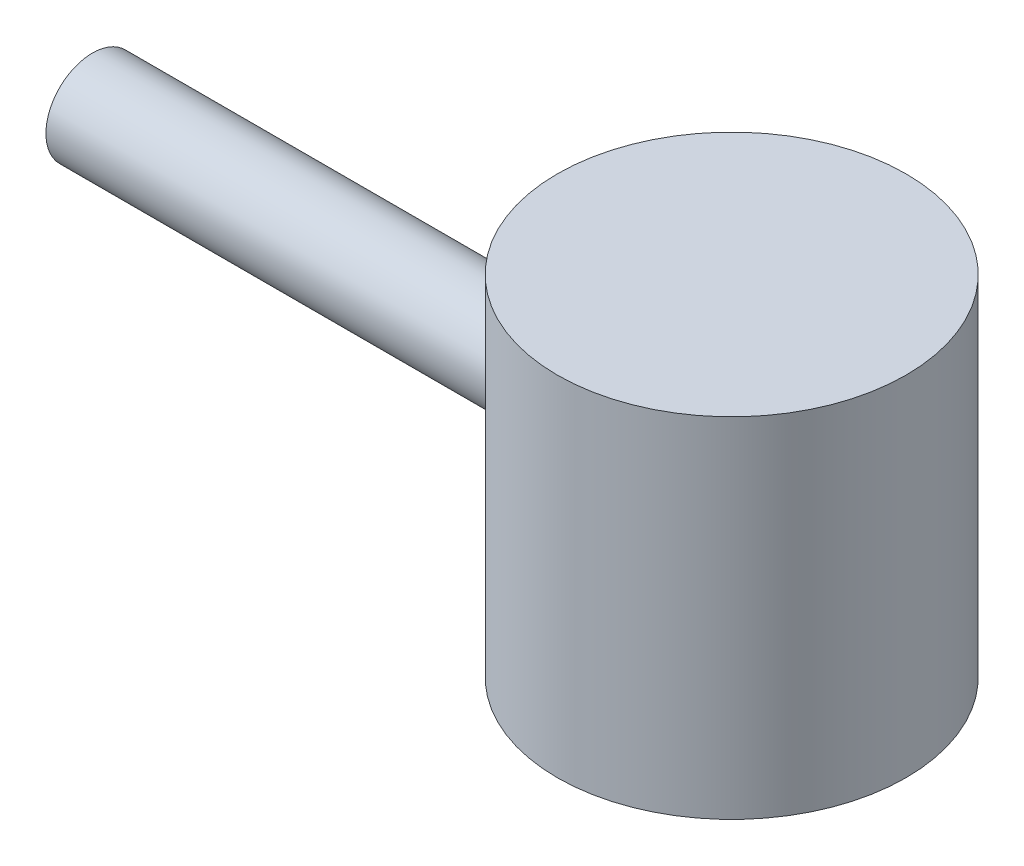
ISO-10303-21;
HEADER;
FILE_DESCRIPTION(('STEP AP214'),'2;1');
FILE_NAME('part.step','',(''),(''),'','','');
FILE_SCHEMA(('AUTOMOTIVE_DESIGN { 1 0 10303 214 1 1 1 1 }'));
ENDSEC;
DATA;
#1=APPLICATION_CONTEXT('core data for automotive mechanical design processes');
#2=APPLICATION_PROTOCOL_DEFINITION('international standard','automotive_design',2000,#1);
#3=PRODUCT_CONTEXT('',#1,'mechanical');
#4=PRODUCT('Part','Part','',(#3));
#5=PRODUCT_RELATED_PRODUCT_CATEGORY('part','',(#4));
#6=PRODUCT_DEFINITION_FORMATION('','',#4);
#7=PRODUCT_DEFINITION_CONTEXT('part definition',#1,'design');
#8=PRODUCT_DEFINITION('design','',#6,#7);
#9=PRODUCT_DEFINITION_SHAPE('','',#8);
#10=(LENGTH_UNIT() NAMED_UNIT(*) SI_UNIT(.MILLI.,.METRE.));
#11=(NAMED_UNIT(*) PLANE_ANGLE_UNIT() SI_UNIT($,.RADIAN.));
#12=(NAMED_UNIT(*) SI_UNIT($,.STERADIAN.) SOLID_ANGLE_UNIT());
#13=UNCERTAINTY_MEASURE_WITH_UNIT(LENGTH_MEASURE(1.E-05),#10,'distance_accuracy_value','');
#14=(GEOMETRIC_REPRESENTATION_CONTEXT(3) GLOBAL_UNCERTAINTY_ASSIGNED_CONTEXT((#13)) GLOBAL_UNIT_ASSIGNED_CONTEXT((#10,
#11,#12)) REPRESENTATION_CONTEXT('',''));
#15=CARTESIAN_POINT('',(0.,0.,0.));
#16=DIRECTION('',(0.,0.,1.));
#17=DIRECTION('',(1.,0.,0.));
#18=AXIS2_PLACEMENT_3D('',#15,#16,#17);
#19=CARTESIAN_POINT('',(0.,7.5,0.));
#20=DIRECTION('',(0.,-1.,0.));
#21=DIRECTION('',(0.,0.,-1.));
#22=AXIS2_PLACEMENT_3D('',#19,#20,#21);
#23=CYLINDRICAL_SURFACE('',#22,7.5);
#24=CARTESIAN_POINT('',(-7.22841614740048,0.,-2.));
#25=CARTESIAN_POINT('',(-7.22841805697252,0.110175937740283,-1.99999734315871));
#26=CARTESIAN_POINT('',(-7.23096264549673,0.220380000476016,-1.99086493224743));
#27=CARTESIAN_POINT('',(-7.24083561155097,0.437605421556373,-1.95464583260237));
#28=CARTESIAN_POINT('',(-7.24816638907934,0.54462515497806,-1.92755013620953));
#29=CARTESIAN_POINT('',(-7.26672375176839,0.752308069946777,-1.85635845560073));
#30=CARTESIAN_POINT('',(-7.27794485684204,0.852979958828426,-1.81228637542178));
#31=CARTESIAN_POINT('',(-7.30301154920401,1.04551674005983,-1.70846784563703));
#32=CARTESIAN_POINT('',(-7.31685734034424,1.13738094750699,-1.6487201784145));
#33=CARTESIAN_POINT('',(-7.34600139553467,1.31199254698772,-1.51364847874559));
#34=CARTESIAN_POINT('',(-7.36132541116443,1.39448701746446,-1.43800297504208));
#35=CARTESIAN_POINT('',(-7.39147701436507,1.5457815769512,-1.27397427284021));
#36=CARTESIAN_POINT('',(-7.40630455033439,1.61458024614179,-1.18558975534664));
#37=CARTESIAN_POINT('',(-7.43407988468418,1.73758493840293,-0.99683817087327));
#38=CARTESIAN_POINT('',(-7.44699376262293,1.79153951863286,-0.89630181987948));
#39=CARTESIAN_POINT('',(-7.46919126211834,1.88168463536726,-0.687183044729091));
#40=CARTESIAN_POINT('',(-7.47847549576262,1.91787816728156,-0.578601980875103));
#41=CARTESIAN_POINT('',(-7.49218553576461,1.97065522023577,-0.35911596181009));
#42=CARTESIAN_POINT('',(-7.49671776750265,1.98766897662592,-0.248321224200916));
#43=CARTESIAN_POINT('',(-7.50078524617749,2.00295712010718,-0.0253635535085758));
#44=CARTESIAN_POINT('',(-7.50032132946608,2.00123464363014,0.0867991474385297));
#45=CARTESIAN_POINT('',(-7.49452675859765,1.97940218746053,0.306314237111346));
#46=CARTESIAN_POINT('',(-7.48931914026999,1.95975704236371,0.41371660072111));
#47=CARTESIAN_POINT('',(-7.4747674859047,1.90338786221805,0.623641315571054));
#48=CARTESIAN_POINT('',(-7.46542321400589,1.86666285331396,0.72616338818058));
#49=CARTESIAN_POINT('',(-7.44346569099892,1.77682015240762,0.924603945147553));
#50=CARTESIAN_POINT('',(-7.43082087877672,1.7235431928993,1.02044668632954));
#51=CARTESIAN_POINT('',(-7.40362468509504,1.6022311804909,1.20198999876451));
#52=CARTESIAN_POINT('',(-7.38907293223,1.53419325097182,1.28768858808586));
#53=CARTESIAN_POINT('',(-7.35911272938719,1.38282314206609,1.44928536946561));
#54=CARTESIAN_POINT('',(-7.34369169368738,1.29908555495064,1.52480192017773));
#55=CARTESIAN_POINT('',(-7.31413405023521,1.11997532376118,1.6608133210477));
#56=CARTESIAN_POINT('',(-7.29999752083065,1.02460197079955,1.72130725529808));
#57=CARTESIAN_POINT('',(-7.27455902280777,0.824099898178691,1.82584679186274));
#58=CARTESIAN_POINT('',(-7.26327507092156,0.718914649086844,1.86978866600526));
#59=CARTESIAN_POINT('',(-7.24504325087515,0.502273500545035,1.93924001685674));
#60=CARTESIAN_POINT('',(-7.23809430746845,0.390819163549671,1.96475406461341));
#61=CARTESIAN_POINT('',(-7.22954835612976,0.168372788971642,1.99596757092855));
#62=CARTESIAN_POINT('',(-7.22779763213457,0.0574664513786878,2.00223632621177));
#63=CARTESIAN_POINT('',(-7.22942578390815,-0.163809772808551,1.9963498112297));
#64=CARTESIAN_POINT('',(-7.23280411376438,-0.27417971523995,1.98419650172323));
#65=CARTESIAN_POINT('',(-7.24416124318865,-0.489056594091546,1.94231271869971));
#66=CARTESIAN_POINT('',(-7.25205039699299,-0.59363543793723,1.91292447912922));
#67=CARTESIAN_POINT('',(-7.27145268952784,-0.796379631359934,1.83778986725474));
#68=CARTESIAN_POINT('',(-7.28296630148563,-0.894544141427426,1.79204135876651));
#69=CARTESIAN_POINT('',(-7.30863572472984,-1.08405495743521,1.68432905508707));
#70=CARTESIAN_POINT('',(-7.32284404872864,-1.17520397588973,1.62203095237924));
#71=CARTESIAN_POINT('',(-7.35217841933666,-1.34596330170316,1.48340227987515));
#72=CARTESIAN_POINT('',(-7.36730463810238,-1.42557143495415,1.40706907222966));
#73=CARTESIAN_POINT('',(-7.39729964884456,-1.57335247324992,1.23990378250484));
#74=CARTESIAN_POINT('',(-7.41214836523849,-1.64112837697858,1.14871641600885));
#75=CARTESIAN_POINT('',(-7.43946670017127,-1.76041098741052,0.955928435940743));
#76=CARTESIAN_POINT('',(-7.45193644532905,-1.81191856007892,0.854328377018884));
#77=CARTESIAN_POINT('',(-7.47301150899261,-1.89672963236151,0.644314134825872));
#78=CARTESIAN_POINT('',(-7.48164558480385,-1.93016901944347,0.535957852882337));
#79=CARTESIAN_POINT('',(-7.49420303787247,-1.97828872806436,0.31489938473132));
#80=CARTESIAN_POINT('',(-7.4981274590498,-1.99297320677468,0.202198167320243));
#81=CARTESIAN_POINT('',(-7.50077413437691,-2.00290582374144,-0.0206420013461492));
#82=CARTESIAN_POINT('',(-7.49965226288082,-1.99873631913117,-0.130753511527864));
#83=CARTESIAN_POINT('',(-7.4926849097886,-1.97243150642479,-0.348648304630718));
#84=CARTESIAN_POINT('',(-7.48683960554786,-1.95029687288295,-0.456431674812814));
#85=CARTESIAN_POINT('',(-7.47111310390923,-1.8890193950814,-0.665910123464211));
#86=CARTESIAN_POINT('',(-7.46125997189229,-1.84999470652756,-0.767642011851541));
#87=CARTESIAN_POINT('',(-7.43854816516494,-1.75615039825376,-0.963172098471355));
#88=CARTESIAN_POINT('',(-7.42568906899253,-1.70132856338719,-1.05696918166215));
#89=CARTESIAN_POINT('',(-7.39791331224121,-1.57574172786298,-1.23667826867367));
#90=CARTESIAN_POINT('',(-7.38295093371635,-1.50459061930134,-1.32231336173331));
#91=CARTESIAN_POINT('',(-7.35284000077256,-1.34909725063509,-1.48062537156133));
#92=CARTESIAN_POINT('',(-7.33769139839721,-1.26475152418065,-1.55329887243048));
#93=CARTESIAN_POINT('',(-7.30853959638856,-1.0830316041824,-1.68520700232562));
#94=CARTESIAN_POINT('',(-7.29456891224646,-0.985411686342791,-1.74411094261233));
#95=CARTESIAN_POINT('',(-7.26981393903472,-0.781293689139764,-1.84458689030054));
#96=CARTESIAN_POINT('',(-7.25902756724947,-0.674801471460518,-1.88617023367332));
#97=CARTESIAN_POINT('',(-7.24336000653874,-0.473918663948746,-1.94538124252481));
#98=CARTESIAN_POINT('',(-7.23780140272195,-0.380398735443285,-1.96581518399489));
#99=CARTESIAN_POINT('',(-7.2303288521157,-0.191259442006031,-1.9931249429388));
#100=CARTESIAN_POINT('',(-7.22841448976016,-0.0956403177111882,-2.0000023063216));
#101=CARTESIAN_POINT('',(-7.22841614740048,0.,-2.));
#102=B_SPLINE_CURVE_WITH_KNOTS('',3,(#24,#25,#26,#27,#28,#29,#30,#31,#32,#33,#34,#35,#36,#37,
#38,#39,#40,#41,#42,#43,#44,#45,#46,#47,#48,#49,#50,#51,#52,#53,#54,#55,#56,#57,#58,#59,#60,#61,
#62,#63,#64,#65,#66,#67,#68,#69,#70,#71,#72,#73,#74,#75,#76,#77,#78,#79,#80,#81,#82,#83,#84,#85,
#86,#87,#88,#89,#90,#91,#92,#93,#94,#95,#96,#97,#98,#99,#100,#101),.UNSPECIFIED.,.T.,.F.,(4,2,2,
2,2,2,2,2,2,2,2,2,2,2,2,2,2,2,2,2,2,2,2,2,2,2,2,2,2,2,2,2,2,2,2,2,2,2,4),(0.,0.330176128116026,
0.660517947850201,0.990396311596168,1.32030030656105,1.65765916130211,1.99505297124461,
2.33785207370803,2.68059334304246,3.0154830431648,3.35031668385603,3.67670570800803,
4.00311334440695,4.3327644890557,4.66247993394491,5.0023176230033,5.34217602639579,
5.68413015096536,6.02599942418508,6.35765334242023,6.68927196343503,7.01451850432574,
7.33980752864823,7.67224634967772,8.00474771541474,8.34685906959633,8.68895221008103,
9.02843539591401,9.36784331959005,9.69684054916463,10.0258254261296,10.3525451486867,
10.6793107076596,11.0147885399158,11.3503546538105,11.6933003898558,12.0360213210131,
12.3226696767153,12.6092853429065),.UNSPECIFIED.);
#103=CARTESIAN_POINT('',(-7.22841614740048,0.,-2.));
#104=VERTEX_POINT('',#103);
#105=EDGE_CURVE('E50',#104,#104,#102,.T.);
#106=ORIENTED_EDGE('',*,*,#105,.T.);
#107=EDGE_LOOP('',(#106));
#108=FACE_BOUND('',#107,.T.);
#109=CARTESIAN_POINT('',(0.,7.5,0.));
#110=DIRECTION('',(0.,1.,0.));
#111=DIRECTION('',(0.,0.,1.));
#112=AXIS2_PLACEMENT_3D('',#109,#110,#111);
#113=CIRCLE('',#112,7.5);
#114=CARTESIAN_POINT('',(0.,7.5,7.5));
#115=VERTEX_POINT('',#114);
#116=EDGE_CURVE('E10',#115,#115,#113,.T.);
#117=ORIENTED_EDGE('',*,*,#116,.F.);
#118=EDGE_LOOP('',(#117));
#119=FACE_BOUND('',#118,.T.);
#120=CARTESIAN_POINT('',(0.,-7.5,0.));
#121=DIRECTION('',(0.,1.,0.));
#122=DIRECTION('',(0.,0.,1.));
#123=AXIS2_PLACEMENT_3D('',#120,#121,#122);
#124=CIRCLE('',#123,7.5);
#125=CARTESIAN_POINT('',(0.,-7.5,7.5));
#126=VERTEX_POINT('',#125);
#127=EDGE_CURVE('E57',#126,#126,#124,.T.);
#128=ORIENTED_EDGE('',*,*,#127,.T.);
#129=EDGE_LOOP('',(#128));
#130=FACE_BOUND('',#129,.T.);
#131=ADVANCED_FACE('F43',(#108,#119,#130),#23,.T.);
#132=CARTESIAN_POINT('',(0.,7.5,0.));
#133=DIRECTION('',(0.,1.,0.));
#134=DIRECTION('',(0.,0.,1.));
#135=AXIS2_PLACEMENT_3D('',#132,#133,#134);
#136=PLANE('',#135);
#137=ORIENTED_EDGE('',*,*,#116,.T.);
#138=EDGE_LOOP('',(#137));
#139=FACE_BOUND('',#138,.T.);
#140=ADVANCED_FACE('F82',(#139),#136,.T.);
#141=CARTESIAN_POINT('',(0.,-7.5,0.));
#142=DIRECTION('',(0.,1.,0.));
#143=DIRECTION('',(0.,0.,1.));
#144=AXIS2_PLACEMENT_3D('',#141,#142,#143);
#145=PLANE('',#144);
#146=ORIENTED_EDGE('',*,*,#127,.F.);
#147=EDGE_LOOP('',(#146));
#148=FACE_BOUND('',#147,.T.);
#149=ADVANCED_FACE('F77',(#148),#145,.F.);
#150=CARTESIAN_POINT('',(-27.5,0.,0.));
#151=DIRECTION('',(1.,0.,0.));
#152=DIRECTION('',(0.,0.,-1.));
#153=AXIS2_PLACEMENT_3D('',#150,#151,#152);
#154=CYLINDRICAL_SURFACE('',#153,2.);
#155=CARTESIAN_POINT('',(-27.5,0.,0.));
#156=DIRECTION('',(1.,0.,0.));
#157=DIRECTION('',(0.,0.,-1.));
#158=AXIS2_PLACEMENT_3D('',#155,#156,#157);
#159=CIRCLE('',#158,2.);
#160=CARTESIAN_POINT('',(-27.5,0.,-2.));
#161=VERTEX_POINT('',#160);
#162=EDGE_CURVE('E61',#161,#161,#159,.T.);
#163=ORIENTED_EDGE('',*,*,#162,.T.);
#164=EDGE_LOOP('',(#163));
#165=FACE_BOUND('',#164,.T.);
#166=ORIENTED_EDGE('',*,*,#105,.F.);
#167=EDGE_LOOP('',(#166));
#168=FACE_BOUND('',#167,.T.);
#169=ADVANCED_FACE('F72',(#165,#168),#154,.T.);
#170=CARTESIAN_POINT('',(-27.5,0.,0.));
#171=DIRECTION('',(1.,0.,0.));
#172=DIRECTION('',(0.,0.,-1.));
#173=AXIS2_PLACEMENT_3D('',#170,#171,#172);
#174=PLANE('',#173);
#175=ORIENTED_EDGE('',*,*,#162,.F.);
#176=EDGE_LOOP('',(#175));
#177=FACE_BOUND('',#176,.T.);
#178=ADVANCED_FACE('F78',(#177),#174,.F.);
#179=CLOSED_SHELL('',(#131,#140,#149,#169,#178));
#180=MANIFOLD_SOLID_BREP('B2',#179);
#181=ADVANCED_BREP_SHAPE_REPRESENTATION('',(#18,#180),#14);
#182=SHAPE_DEFINITION_REPRESENTATION(#9,#181);
ENDSEC;
END-ISO-10303-21;
